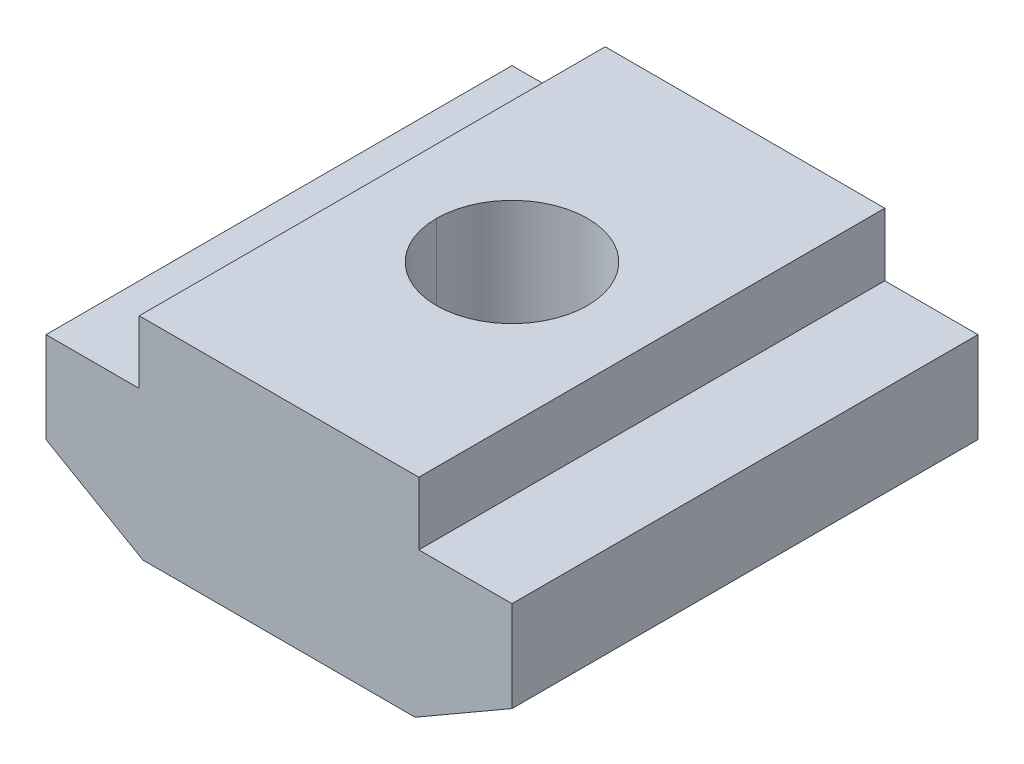
ISO-10303-21;
HEADER;
FILE_DESCRIPTION(('STEP AP214'),'2;1');
FILE_NAME('part.step','',(''),(''),'','','');
FILE_SCHEMA(('AUTOMOTIVE_DESIGN { 1 0 10303 214 1 1 1 1 }'));
ENDSEC;
DATA;
#1=APPLICATION_CONTEXT('core data for automotive mechanical design processes');
#2=APPLICATION_PROTOCOL_DEFINITION('international standard','automotive_design',2000,#1);
#3=PRODUCT_CONTEXT('',#1,'mechanical');
#4=PRODUCT('Part','Part','',(#3));
#5=PRODUCT_RELATED_PRODUCT_CATEGORY('part','',(#4));
#6=PRODUCT_DEFINITION_FORMATION('','',#4);
#7=PRODUCT_DEFINITION_CONTEXT('part definition',#1,'design');
#8=PRODUCT_DEFINITION('design','',#6,#7);
#9=PRODUCT_DEFINITION_SHAPE('','',#8);
#10=(LENGTH_UNIT() NAMED_UNIT(*) SI_UNIT(.MILLI.,.METRE.));
#11=(NAMED_UNIT(*) PLANE_ANGLE_UNIT() SI_UNIT($,.RADIAN.));
#12=(NAMED_UNIT(*) SI_UNIT($,.STERADIAN.) SOLID_ANGLE_UNIT());
#13=UNCERTAINTY_MEASURE_WITH_UNIT(LENGTH_MEASURE(1.E-05),#10,'distance_accuracy_value','');
#14=(GEOMETRIC_REPRESENTATION_CONTEXT(3) GLOBAL_UNCERTAINTY_ASSIGNED_CONTEXT((#13)) GLOBAL_UNIT_ASSIGNED_CONTEXT((#10,
#11,#12)) REPRESENTATION_CONTEXT('',''));
#15=CARTESIAN_POINT('',(0.,0.,0.));
#16=DIRECTION('',(0.,0.,1.));
#17=DIRECTION('',(1.,0.,0.));
#18=AXIS2_PLACEMENT_3D('',#15,#16,#17);
#19=CARTESIAN_POINT('',(-5.,-0.375,0.));
#20=DIRECTION('',(0.50000000000019,0.866025403784329,0.));
#21=DIRECTION('',(0.,0.,-1.));
#22=AXIS2_PLACEMENT_3D('',#19,#20,#21);
#23=PLANE('',#22);
#24=DIRECTION('',(0.,0.,1.));
#25=VECTOR('',#24,1.);
#26=CARTESIAN_POINT('',(-5.,-0.375,0.));
#27=LINE('',#26,#25);
#28=CARTESIAN_POINT('',(-5.,-0.375,-5.));
#29=VERTEX_POINT('',#28);
#30=CARTESIAN_POINT('',(-5.,-0.375,5.));
#31=VERTEX_POINT('',#30);
#32=EDGE_CURVE('E185',#29,#31,#27,.T.);
#33=ORIENTED_EDGE('',*,*,#32,.F.);
#34=DIRECTION('',(0.866025403784329,-0.50000000000019,0.));
#35=VECTOR('',#34,1.);
#36=CARTESIAN_POINT('',(-3.96076951546,-0.975,-5.));
#37=LINE('',#36,#35);
#38=CARTESIAN_POINT('',(-2.92153903092,-1.575,-5.));
#39=VERTEX_POINT('',#38);
#40=EDGE_CURVE('E176',#29,#39,#37,.T.);
#41=ORIENTED_EDGE('',*,*,#40,.T.);
#42=DIRECTION('',(0.,0.,1.));
#43=VECTOR('',#42,1.);
#44=CARTESIAN_POINT('',(-2.92153903092,-1.575,0.));
#45=LINE('',#44,#43);
#46=CARTESIAN_POINT('',(-2.92153903092,-1.575,5.));
#47=VERTEX_POINT('',#46);
#48=EDGE_CURVE('E11',#39,#47,#45,.T.);
#49=ORIENTED_EDGE('',*,*,#48,.T.);
#50=DIRECTION('',(-0.866025403784329,0.50000000000019,0.));
#51=VECTOR('',#50,1.);
#52=CARTESIAN_POINT('',(-3.96076951546,-0.975,5.));
#53=LINE('',#52,#51);
#54=EDGE_CURVE('E25',#47,#31,#53,.T.);
#55=ORIENTED_EDGE('',*,*,#54,.T.);
#56=EDGE_LOOP('',(#33,#41,#49,#55));
#57=FACE_BOUND('',#56,.T.);
#58=ADVANCED_FACE('F17',(#57),#23,.F.);
#59=CARTESIAN_POINT('',(5.,-1.575,0.));
#60=DIRECTION('',(0.,1.,0.));
#61=DIRECTION('',(1.,0.,0.));
#62=AXIS2_PLACEMENT_3D('',#59,#60,#61);
#63=PLANE('',#62);
#64=CARTESIAN_POINT('',(0.,-1.575,0.));
#65=DIRECTION('',(0.,1.,0.));
#66=DIRECTION('',(1.,0.,0.));
#67=AXIS2_PLACEMENT_3D('',#64,#65,#66);
#68=CIRCLE('',#67,1.621);
#69=CARTESIAN_POINT('',(-1.621,-1.575,0.));
#70=VERTEX_POINT('',#69);
#71=CARTESIAN_POINT('',(1.621,-1.575,0.));
#72=VERTEX_POINT('',#71);
#73=EDGE_CURVE('E144',#70,#72,#68,.T.);
#74=ORIENTED_EDGE('',*,*,#73,.T.);
#75=CARTESIAN_POINT('',(0.,-1.575,0.));
#76=DIRECTION('',(0.,1.,0.));
#77=DIRECTION('',(1.,0.,0.));
#78=AXIS2_PLACEMENT_3D('',#75,#76,#77);
#79=CIRCLE('',#78,1.621);
#80=EDGE_CURVE('E143',#72,#70,#79,.T.);
#81=ORIENTED_EDGE('',*,*,#80,.T.);
#82=EDGE_LOOP('',(#74,#81));
#83=FACE_BOUND('',#82,.T.);
#84=ORIENTED_EDGE('',*,*,#48,.F.);
#85=DIRECTION('',(1.,0.,0.));
#86=VECTOR('',#85,1.);
#87=CARTESIAN_POINT('',(0.,-1.575,-5.));
#88=LINE('',#87,#86);
#89=CARTESIAN_POINT('',(2.92153903092,-1.575,-5.));
#90=VERTEX_POINT('',#89);
#91=EDGE_CURVE('E173',#39,#90,#88,.T.);
#92=ORIENTED_EDGE('',*,*,#91,.T.);
#93=DIRECTION('',(0.,0.,1.));
#94=VECTOR('',#93,1.);
#95=CARTESIAN_POINT('',(2.92153903092,-1.575,0.));
#96=LINE('',#95,#94);
#97=CARTESIAN_POINT('',(2.92153903092,-1.575,5.));
#98=VERTEX_POINT('',#97);
#99=EDGE_CURVE('E234',#90,#98,#96,.T.);
#100=ORIENTED_EDGE('',*,*,#99,.T.);
#101=DIRECTION('',(1.,0.,0.));
#102=VECTOR('',#101,1.);
#103=CARTESIAN_POINT('',(0.,-1.575,5.));
#104=LINE('',#103,#102);
#105=EDGE_CURVE('E175',#47,#98,#104,.T.);
#106=ORIENTED_EDGE('',*,*,#105,.F.);
#107=EDGE_LOOP('',(#84,#92,#100,#106));
#108=FACE_BOUND('',#107,.T.);
#109=ADVANCED_FACE('F283',(#83,#108),#63,.F.);
#110=CARTESIAN_POINT('',(0.,0.,5.));
#111=DIRECTION('',(0.,0.,1.));
#112=DIRECTION('',(1.,0.,0.));
#113=AXIS2_PLACEMENT_3D('',#110,#111,#112);
#114=PLANE('',#113);
#115=ORIENTED_EDGE('',*,*,#105,.T.);
#116=DIRECTION('',(-0.866025403784329,-0.50000000000019,0.));
#117=VECTOR('',#116,1.);
#118=CARTESIAN_POINT('',(3.96076951546,-0.975,5.));
#119=LINE('',#118,#117);
#120=CARTESIAN_POINT('',(5.,-0.375,5.));
#121=VERTEX_POINT('',#120);
#122=EDGE_CURVE('E190',#121,#98,#119,.T.);
#123=ORIENTED_EDGE('',*,*,#122,.F.);
#124=DIRECTION('',(0.,1.,0.));
#125=VECTOR('',#124,1.);
#126=CARTESIAN_POINT('',(5.,0.6,5.));
#127=LINE('',#126,#125);
#128=CARTESIAN_POINT('',(5.,1.575,5.));
#129=VERTEX_POINT('',#128);
#130=EDGE_CURVE('E239',#121,#129,#127,.T.);
#131=ORIENTED_EDGE('',*,*,#130,.T.);
#132=DIRECTION('',(-1.,0.,0.));
#133=VECTOR('',#132,1.);
#134=CARTESIAN_POINT('',(4.,1.575,5.));
#135=LINE('',#134,#133);
#136=CARTESIAN_POINT('',(3.,1.575,5.));
#137=VERTEX_POINT('',#136);
#138=EDGE_CURVE('E170',#129,#137,#135,.T.);
#139=ORIENTED_EDGE('',*,*,#138,.T.);
#140=DIRECTION('',(0.,1.,0.));
#141=VECTOR('',#140,1.);
#142=CARTESIAN_POINT('',(3.,2.25,5.));
#143=LINE('',#142,#141);
#144=CARTESIAN_POINT('',(3.,2.925,5.));
#145=VERTEX_POINT('',#144);
#146=EDGE_CURVE('E226',#137,#145,#143,.T.);
#147=ORIENTED_EDGE('',*,*,#146,.T.);
#148=DIRECTION('',(-1.,0.,0.));
#149=VECTOR('',#148,1.);
#150=CARTESIAN_POINT('',(0.,2.925,5.));
#151=LINE('',#150,#149);
#152=CARTESIAN_POINT('',(-3.,2.925,5.));
#153=VERTEX_POINT('',#152);
#154=EDGE_CURVE('E233',#145,#153,#151,.T.);
#155=ORIENTED_EDGE('',*,*,#154,.T.);
#156=DIRECTION('',(0.,-1.,0.));
#157=VECTOR('',#156,1.);
#158=CARTESIAN_POINT('',(-3.,2.25,5.));
#159=LINE('',#158,#157);
#160=CARTESIAN_POINT('',(-3.,1.575,5.));
#161=VERTEX_POINT('',#160);
#162=EDGE_CURVE('E215',#153,#161,#159,.T.);
#163=ORIENTED_EDGE('',*,*,#162,.T.);
#164=DIRECTION('',(-1.,0.,0.));
#165=VECTOR('',#164,1.);
#166=CARTESIAN_POINT('',(-4.,1.575,5.));
#167=LINE('',#166,#165);
#168=CARTESIAN_POINT('',(-5.,1.575,5.));
#169=VERTEX_POINT('',#168);
#170=EDGE_CURVE('E198',#161,#169,#167,.T.);
#171=ORIENTED_EDGE('',*,*,#170,.T.);
#172=DIRECTION('',(0.,-1.,0.));
#173=VECTOR('',#172,1.);
#174=CARTESIAN_POINT('',(-5.,0.6,5.));
#175=LINE('',#174,#173);
#176=EDGE_CURVE('E189',#169,#31,#175,.T.);
#177=ORIENTED_EDGE('',*,*,#176,.T.);
#178=ORIENTED_EDGE('',*,*,#54,.F.);
#179=EDGE_LOOP('',(#115,#123,#131,#139,#147,#155,#163,#171,#177,#178));
#180=FACE_BOUND('',#179,.T.);
#181=ADVANCED_FACE('F270',(#180),#114,.T.);
#182=CARTESIAN_POINT('',(0.,0.,-5.));
#183=DIRECTION('',(0.,0.,1.));
#184=DIRECTION('',(1.,0.,0.));
#185=AXIS2_PLACEMENT_3D('',#182,#183,#184);
#186=PLANE('',#185);
#187=ORIENTED_EDGE('',*,*,#40,.F.);
#188=DIRECTION('',(0.,-1.,0.));
#189=VECTOR('',#188,1.);
#190=CARTESIAN_POINT('',(-5.,0.6,-5.));
#191=LINE('',#190,#189);
#192=CARTESIAN_POINT('',(-5.,1.575,-5.));
#193=VERTEX_POINT('',#192);
#194=EDGE_CURVE('E259',#193,#29,#191,.T.);
#195=ORIENTED_EDGE('',*,*,#194,.F.);
#196=DIRECTION('',(-1.,0.,0.));
#197=VECTOR('',#196,1.);
#198=CARTESIAN_POINT('',(-4.,1.575,-5.));
#199=LINE('',#198,#197);
#200=CARTESIAN_POINT('',(-3.,1.575,-5.));
#201=VERTEX_POINT('',#200);
#202=EDGE_CURVE('E161',#201,#193,#199,.T.);
#203=ORIENTED_EDGE('',*,*,#202,.F.);
#204=DIRECTION('',(0.,-1.,0.));
#205=VECTOR('',#204,1.);
#206=CARTESIAN_POINT('',(-3.,2.25,-5.));
#207=LINE('',#206,#205);
#208=CARTESIAN_POINT('',(-3.,2.925,-5.));
#209=VERTEX_POINT('',#208);
#210=EDGE_CURVE('E212',#209,#201,#207,.T.);
#211=ORIENTED_EDGE('',*,*,#210,.F.);
#212=DIRECTION('',(-1.,0.,0.));
#213=VECTOR('',#212,1.);
#214=CARTESIAN_POINT('',(0.,2.925,-5.));
#215=LINE('',#214,#213);
#216=CARTESIAN_POINT('',(3.,2.925,-5.));
#217=VERTEX_POINT('',#216);
#218=EDGE_CURVE('E230',#217,#209,#215,.T.);
#219=ORIENTED_EDGE('',*,*,#218,.F.);
#220=DIRECTION('',(0.,1.,0.));
#221=VECTOR('',#220,1.);
#222=CARTESIAN_POINT('',(3.,2.25,-5.));
#223=LINE('',#222,#221);
#224=CARTESIAN_POINT('',(3.,1.575,-5.));
#225=VERTEX_POINT('',#224);
#226=EDGE_CURVE('E218',#225,#217,#223,.T.);
#227=ORIENTED_EDGE('',*,*,#226,.F.);
#228=DIRECTION('',(-1.,0.,0.));
#229=VECTOR('',#228,1.);
#230=CARTESIAN_POINT('',(4.,1.575,-5.));
#231=LINE('',#230,#229);
#232=CARTESIAN_POINT('',(5.,1.575,-5.));
#233=VERTEX_POINT('',#232);
#234=EDGE_CURVE('E194',#233,#225,#231,.T.);
#235=ORIENTED_EDGE('',*,*,#234,.F.);
#236=DIRECTION('',(0.,1.,0.));
#237=VECTOR('',#236,1.);
#238=CARTESIAN_POINT('',(5.,0.6,-5.));
#239=LINE('',#238,#237);
#240=CARTESIAN_POINT('',(5.,-0.375,-5.));
#241=VERTEX_POINT('',#240);
#242=EDGE_CURVE('E246',#241,#233,#239,.T.);
#243=ORIENTED_EDGE('',*,*,#242,.F.);
#244=DIRECTION('',(0.866025403784329,0.50000000000019,0.));
#245=VECTOR('',#244,1.);
#246=CARTESIAN_POINT('',(3.96076951546,-0.975,-5.));
#247=LINE('',#246,#245);
#248=EDGE_CURVE('E238',#90,#241,#247,.T.);
#249=ORIENTED_EDGE('',*,*,#248,.F.);
#250=ORIENTED_EDGE('',*,*,#91,.F.);
#251=EDGE_LOOP('',(#187,#195,#203,#211,#219,#227,#235,#243,#249,#250));
#252=FACE_BOUND('',#251,.T.);
#253=ADVANCED_FACE('F277',(#252),#186,.F.);
#254=CARTESIAN_POINT('',(-5.,-1.575,0.));
#255=DIRECTION('',(1.,0.,0.));
#256=DIRECTION('',(0.,1.,0.));
#257=AXIS2_PLACEMENT_3D('',#254,#255,#256);
#258=PLANE('',#257);
#259=ORIENTED_EDGE('',*,*,#32,.T.);
#260=ORIENTED_EDGE('',*,*,#176,.F.);
#261=DIRECTION('',(0.,0.,1.));
#262=VECTOR('',#261,1.);
#263=CARTESIAN_POINT('',(-5.,1.575,0.));
#264=LINE('',#263,#262);
#265=EDGE_CURVE('E165',#193,#169,#264,.T.);
#266=ORIENTED_EDGE('',*,*,#265,.F.);
#267=ORIENTED_EDGE('',*,*,#194,.T.);
#268=EDGE_LOOP('',(#259,#260,#266,#267));
#269=FACE_BOUND('',#268,.T.);
#270=ADVANCED_FACE('F274',(#269),#258,.F.);
#271=CARTESIAN_POINT('',(5.,-0.375,0.));
#272=DIRECTION('',(-0.50000000000019,0.866025403784329,0.));
#273=DIRECTION('',(0.,0.,1.));
#274=AXIS2_PLACEMENT_3D('',#271,#272,#273);
#275=PLANE('',#274);
#276=ORIENTED_EDGE('',*,*,#99,.F.);
#277=ORIENTED_EDGE('',*,*,#248,.T.);
#278=DIRECTION('',(0.,0.,1.));
#279=VECTOR('',#278,1.);
#280=CARTESIAN_POINT('',(5.,-0.375,0.));
#281=LINE('',#280,#279);
#282=EDGE_CURVE('E242',#241,#121,#281,.T.);
#283=ORIENTED_EDGE('',*,*,#282,.T.);
#284=ORIENTED_EDGE('',*,*,#122,.T.);
#285=EDGE_LOOP('',(#276,#277,#283,#284));
#286=FACE_BOUND('',#285,.T.);
#287=ADVANCED_FACE('F285',(#286),#275,.F.);
#288=CARTESIAN_POINT('',(5.,1.575,0.));
#289=DIRECTION('',(-1.,0.,0.));
#290=DIRECTION('',(0.,0.,1.));
#291=AXIS2_PLACEMENT_3D('',#288,#289,#290);
#292=PLANE('',#291);
#293=ORIENTED_EDGE('',*,*,#282,.F.);
#294=ORIENTED_EDGE('',*,*,#242,.T.);
#295=DIRECTION('',(0.,0.,1.));
#296=VECTOR('',#295,1.);
#297=CARTESIAN_POINT('',(5.,1.575,0.));
#298=LINE('',#297,#296);
#299=EDGE_CURVE('E180',#233,#129,#298,.T.);
#300=ORIENTED_EDGE('',*,*,#299,.T.);
#301=ORIENTED_EDGE('',*,*,#130,.F.);
#302=EDGE_LOOP('',(#293,#294,#300,#301));
#303=FACE_BOUND('',#302,.T.);
#304=ADVANCED_FACE('F290',(#303),#292,.F.);
#305=CARTESIAN_POINT('',(-3.,2.925,0.));
#306=DIRECTION('',(0.,-1.,0.));
#307=DIRECTION('',(0.,0.,-1.));
#308=AXIS2_PLACEMENT_3D('',#305,#306,#307);
#309=PLANE('',#308);
#310=CARTESIAN_POINT('',(0.,2.925,0.));
#311=DIRECTION('',(0.,-1.,0.));
#312=DIRECTION('',(1.,0.,0.));
#313=AXIS2_PLACEMENT_3D('',#310,#311,#312);
#314=CIRCLE('',#313,1.621);
#315=CARTESIAN_POINT('',(1.621,2.925,0.));
#316=VERTEX_POINT('',#315);
#317=CARTESIAN_POINT('',(-1.621,2.925,0.));
#318=VERTEX_POINT('',#317);
#319=EDGE_CURVE('E146',#316,#318,#314,.T.);
#320=ORIENTED_EDGE('',*,*,#319,.T.);
#321=CARTESIAN_POINT('',(0.,2.925,0.));
#322=DIRECTION('',(0.,-1.,0.));
#323=DIRECTION('',(1.,0.,0.));
#324=AXIS2_PLACEMENT_3D('',#321,#322,#323);
#325=CIRCLE('',#324,1.621);
#326=EDGE_CURVE('E133',#318,#316,#325,.T.);
#327=ORIENTED_EDGE('',*,*,#326,.T.);
#328=EDGE_LOOP('',(#320,#327));
#329=FACE_BOUND('',#328,.T.);
#330=DIRECTION('',(0.,0.,1.));
#331=VECTOR('',#330,1.);
#332=CARTESIAN_POINT('',(3.,2.925,0.));
#333=LINE('',#332,#331);
#334=EDGE_CURVE('E222',#217,#145,#333,.T.);
#335=ORIENTED_EDGE('',*,*,#334,.F.);
#336=ORIENTED_EDGE('',*,*,#218,.T.);
#337=DIRECTION('',(0.,0.,1.));
#338=VECTOR('',#337,1.);
#339=CARTESIAN_POINT('',(-3.,2.925,0.));
#340=LINE('',#339,#338);
#341=EDGE_CURVE('E202',#209,#153,#340,.T.);
#342=ORIENTED_EDGE('',*,*,#341,.T.);
#343=ORIENTED_EDGE('',*,*,#154,.F.);
#344=EDGE_LOOP('',(#335,#336,#342,#343));
#345=FACE_BOUND('',#344,.T.);
#346=ADVANCED_FACE('F147',(#329,#345),#309,.F.);
#347=CARTESIAN_POINT('',(3.,2.925,0.));
#348=DIRECTION('',(-1.,0.,0.));
#349=DIRECTION('',(0.,0.,1.));
#350=AXIS2_PLACEMENT_3D('',#347,#348,#349);
#351=PLANE('',#350);
#352=DIRECTION('',(0.,0.,1.));
#353=VECTOR('',#352,1.);
#354=CARTESIAN_POINT('',(3.,1.575,0.));
#355=LINE('',#354,#353);
#356=EDGE_CURVE('E184',#225,#137,#355,.T.);
#357=ORIENTED_EDGE('',*,*,#356,.F.);
#358=ORIENTED_EDGE('',*,*,#226,.T.);
#359=ORIENTED_EDGE('',*,*,#334,.T.);
#360=ORIENTED_EDGE('',*,*,#146,.F.);
#361=EDGE_LOOP('',(#357,#358,#359,#360));
#362=FACE_BOUND('',#361,.T.);
#363=ADVANCED_FACE('F299',(#362),#351,.F.);
#364=CARTESIAN_POINT('',(-3.,1.575,0.));
#365=DIRECTION('',(1.,0.,0.));
#366=DIRECTION('',(0.,1.,0.));
#367=AXIS2_PLACEMENT_3D('',#364,#365,#366);
#368=PLANE('',#367);
#369=ORIENTED_EDGE('',*,*,#341,.F.);
#370=ORIENTED_EDGE('',*,*,#210,.T.);
#371=DIRECTION('',(0.,0.,1.));
#372=VECTOR('',#371,1.);
#373=CARTESIAN_POINT('',(-3.,1.575,0.));
#374=LINE('',#373,#372);
#375=EDGE_CURVE('E166',#201,#161,#374,.T.);
#376=ORIENTED_EDGE('',*,*,#375,.T.);
#377=ORIENTED_EDGE('',*,*,#162,.F.);
#378=EDGE_LOOP('',(#369,#370,#376,#377));
#379=FACE_BOUND('',#378,.T.);
#380=ADVANCED_FACE('F302',(#379),#368,.F.);
#381=CARTESIAN_POINT('',(3.,1.575,0.));
#382=DIRECTION('',(0.,-1.,0.));
#383=DIRECTION('',(0.,0.,-1.));
#384=AXIS2_PLACEMENT_3D('',#381,#382,#383);
#385=PLANE('',#384);
#386=ORIENTED_EDGE('',*,*,#375,.F.);
#387=ORIENTED_EDGE('',*,*,#202,.T.);
#388=ORIENTED_EDGE('',*,*,#265,.T.);
#389=ORIENTED_EDGE('',*,*,#170,.F.);
#390=EDGE_LOOP('',(#386,#387,#388,#389));
#391=FACE_BOUND('',#390,.T.);
#392=ADVANCED_FACE('F304',(#391),#385,.F.);
#393=CARTESIAN_POINT('',(3.,1.575,0.));
#394=DIRECTION('',(0.,-1.,0.));
#395=DIRECTION('',(0.,0.,-1.));
#396=AXIS2_PLACEMENT_3D('',#393,#394,#395);
#397=PLANE('',#396);
#398=ORIENTED_EDGE('',*,*,#299,.F.);
#399=ORIENTED_EDGE('',*,*,#234,.T.);
#400=ORIENTED_EDGE('',*,*,#356,.T.);
#401=ORIENTED_EDGE('',*,*,#138,.F.);
#402=EDGE_LOOP('',(#398,#399,#400,#401));
#403=FACE_BOUND('',#402,.T.);
#404=ADVANCED_FACE('F294',(#403),#397,.F.);
#405=CARTESIAN_POINT('',(0.,-1.575,0.));
#406=DIRECTION('',(0.,1.,0.));
#407=DIRECTION('',(1.,0.,0.));
#408=AXIS2_PLACEMENT_3D('',#405,#406,#407);
#409=CYLINDRICAL_SURFACE('',#408,1.621);
#410=DIRECTION('',(0.,-1.,0.));
#411=VECTOR('',#410,1.);
#412=CARTESIAN_POINT('',(1.621,3.26999999998,0.));
#413=LINE('',#412,#411);
#414=EDGE_CURVE('E139',#316,#72,#413,.T.);
#415=ORIENTED_EDGE('',*,*,#414,.F.);
#416=ORIENTED_EDGE('',*,*,#326,.F.);
#417=DIRECTION('',(0.,-1.,0.));
#418=VECTOR('',#417,1.);
#419=CARTESIAN_POINT('',(-1.621,3.26999999998,0.));
#420=LINE('',#419,#418);
#421=EDGE_CURVE('E137',#318,#70,#420,.T.);
#422=ORIENTED_EDGE('',*,*,#421,.T.);
#423=ORIENTED_EDGE('',*,*,#80,.F.);
#424=EDGE_LOOP('',(#415,#416,#422,#423));
#425=FACE_BOUND('',#424,.T.);
#426=ADVANCED_FACE('F135',(#425),#409,.F.);
#427=CARTESIAN_POINT('',(0.,-1.575,0.));
#428=DIRECTION('',(0.,1.,0.));
#429=DIRECTION('',(1.,0.,0.));
#430=AXIS2_PLACEMENT_3D('',#427,#428,#429);
#431=CYLINDRICAL_SURFACE('',#430,1.621);
#432=ORIENTED_EDGE('',*,*,#421,.F.);
#433=ORIENTED_EDGE('',*,*,#319,.F.);
#434=ORIENTED_EDGE('',*,*,#414,.T.);
#435=ORIENTED_EDGE('',*,*,#73,.F.);
#436=EDGE_LOOP('',(#432,#433,#434,#435));
#437=FACE_BOUND('',#436,.T.);
#438=ADVANCED_FACE('F153',(#437),#431,.F.);
#439=CLOSED_SHELL('',(#58,#109,#181,#253,#270,#287,#304,#346,#363,#380,#392,#404,#426,#438));
#440=MANIFOLD_SOLID_BREP('B1',#439);
#441=ADVANCED_BREP_SHAPE_REPRESENTATION('',(#18,#440),#14);
#442=SHAPE_DEFINITION_REPRESENTATION(#9,#441);
ENDSEC;
END-ISO-10303-21;
